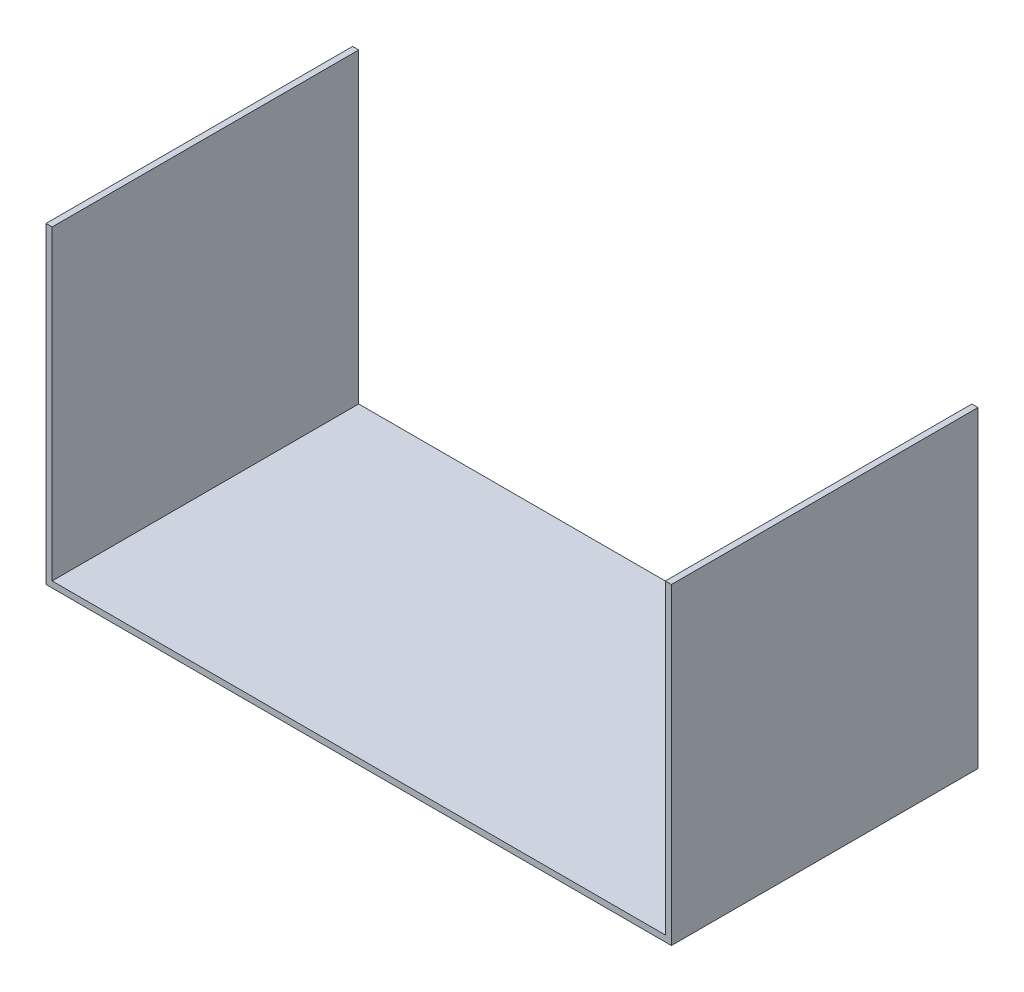
ISO-10303-21;
HEADER;
FILE_DESCRIPTION(('STEP AP214'),'2;1');
FILE_NAME('part.step','',(''),(''),'','','');
FILE_SCHEMA(('AUTOMOTIVE_DESIGN { 1 0 10303 214 1 1 1 1 }'));
ENDSEC;
DATA;
#1=APPLICATION_CONTEXT('core data for automotive mechanical design processes');
#2=APPLICATION_PROTOCOL_DEFINITION('international standard','automotive_design',2000,#1);
#3=PRODUCT_CONTEXT('',#1,'mechanical');
#4=PRODUCT('Part','Part','',(#3));
#5=PRODUCT_RELATED_PRODUCT_CATEGORY('part','',(#4));
#6=PRODUCT_DEFINITION_FORMATION('','',#4);
#7=PRODUCT_DEFINITION_CONTEXT('part definition',#1,'design');
#8=PRODUCT_DEFINITION('design','',#6,#7);
#9=PRODUCT_DEFINITION_SHAPE('','',#8);
#10=(LENGTH_UNIT() NAMED_UNIT(*) SI_UNIT(.MILLI.,.METRE.));
#11=(NAMED_UNIT(*) PLANE_ANGLE_UNIT() SI_UNIT($,.RADIAN.));
#12=(NAMED_UNIT(*) SI_UNIT($,.STERADIAN.) SOLID_ANGLE_UNIT());
#13=UNCERTAINTY_MEASURE_WITH_UNIT(LENGTH_MEASURE(1.E-05),#10,'distance_accuracy_value','');
#14=(GEOMETRIC_REPRESENTATION_CONTEXT(3) GLOBAL_UNCERTAINTY_ASSIGNED_CONTEXT((#13)) GLOBAL_UNIT_ASSIGNED_CONTEXT((#10,
#11,#12)) REPRESENTATION_CONTEXT('',''));
#15=CARTESIAN_POINT('',(0.,0.,0.));
#16=DIRECTION('',(0.,0.,1.));
#17=DIRECTION('',(1.,0.,0.));
#18=AXIS2_PLACEMENT_3D('',#15,#16,#17);
#19=CARTESIAN_POINT('',(-200.,0.,10000.));
#20=DIRECTION('',(0.,-1.,0.));
#21=DIRECTION('',(0.,0.,-1.));
#22=AXIS2_PLACEMENT_3D('',#19,#20,#21);
#23=PLANE('',#22);
#24=DIRECTION('',(-1.,0.,0.));
#25=VECTOR('',#24,1.);
#26=CARTESIAN_POINT('',(-200.,0.,0.));
#27=LINE('',#26,#25);
#28=CARTESIAN_POINT('',(0.,0.,0.));
#29=VERTEX_POINT('',#28);
#30=CARTESIAN_POINT('',(-200.,0.,0.));
#31=VERTEX_POINT('',#30);
#32=EDGE_CURVE('E137',#29,#31,#27,.T.);
#33=ORIENTED_EDGE('',*,*,#32,.T.);
#34=DIRECTION('',(0.,0.,-1.));
#35=VECTOR('',#34,1.);
#36=CARTESIAN_POINT('',(-200.,0.,10000.));
#37=LINE('',#36,#35);
#38=CARTESIAN_POINT('',(-200.,0.,10000.));
#39=VERTEX_POINT('',#38);
#40=EDGE_CURVE('E11',#39,#31,#37,.T.);
#41=ORIENTED_EDGE('',*,*,#40,.F.);
#42=DIRECTION('',(-1.,0.,0.));
#43=VECTOR('',#42,1.);
#44=CARTESIAN_POINT('',(-200.,0.,10000.));
#45=LINE('',#44,#43);
#46=CARTESIAN_POINT('',(0.,0.,10000.));
#47=VERTEX_POINT('',#46);
#48=EDGE_CURVE('E151',#47,#39,#45,.T.);
#49=ORIENTED_EDGE('',*,*,#48,.F.);
#50=DIRECTION('',(0.,0.,-1.));
#51=VECTOR('',#50,1.);
#52=CARTESIAN_POINT('',(0.,0.,10000.));
#53=LINE('',#52,#51);
#54=EDGE_CURVE('E133',#47,#29,#53,.T.);
#55=ORIENTED_EDGE('',*,*,#54,.T.);
#56=EDGE_LOOP('',(#33,#41,#49,#55));
#57=FACE_BOUND('',#56,.T.);
#58=ADVANCED_FACE('F41',(#57),#23,.F.);
#59=CARTESIAN_POINT('',(-200.,0.,10000.));
#60=DIRECTION('',(1.,0.,0.));
#61=DIRECTION('',(0.,0.,-1.));
#62=AXIS2_PLACEMENT_3D('',#59,#60,#61);
#63=PLANE('',#62);
#64=DIRECTION('',(0.,-1.,0.));
#65=VECTOR('',#64,1.);
#66=CARTESIAN_POINT('',(-200.,0.,0.));
#67=LINE('',#66,#65);
#68=CARTESIAN_POINT('',(-200.,-10200.,0.));
#69=VERTEX_POINT('',#68);
#70=EDGE_CURVE('E140',#31,#69,#67,.T.);
#71=ORIENTED_EDGE('',*,*,#70,.T.);
#72=DIRECTION('',(0.,0.,-1.));
#73=VECTOR('',#72,1.);
#74=CARTESIAN_POINT('',(-200.,-10200.,10000.));
#75=LINE('',#74,#73);
#76=CARTESIAN_POINT('',(-200.,-10200.,10000.));
#77=VERTEX_POINT('',#76);
#78=EDGE_CURVE('E49',#77,#69,#75,.T.);
#79=ORIENTED_EDGE('',*,*,#78,.F.);
#80=DIRECTION('',(0.,-1.,0.));
#81=VECTOR('',#80,1.);
#82=CARTESIAN_POINT('',(-200.,0.,10000.));
#83=LINE('',#82,#81);
#84=EDGE_CURVE('E100',#39,#77,#83,.T.);
#85=ORIENTED_EDGE('',*,*,#84,.F.);
#86=ORIENTED_EDGE('',*,*,#40,.T.);
#87=EDGE_LOOP('',(#71,#79,#85,#86));
#88=FACE_BOUND('',#87,.T.);
#89=ADVANCED_FACE('F186',(#88),#63,.F.);
#90=CARTESIAN_POINT('',(-200.,-10200.,10000.));
#91=DIRECTION('',(0.,1.,0.));
#92=DIRECTION('',(0.,0.,1.));
#93=AXIS2_PLACEMENT_3D('',#90,#91,#92);
#94=PLANE('',#93);
#95=DIRECTION('',(1.,0.,0.));
#96=VECTOR('',#95,1.);
#97=CARTESIAN_POINT('',(-200.,-10200.,0.));
#98=LINE('',#97,#96);
#99=CARTESIAN_POINT('',(20200.,-10200.,0.));
#100=VERTEX_POINT('',#99);
#101=EDGE_CURVE('E142',#69,#100,#98,.T.);
#102=ORIENTED_EDGE('',*,*,#101,.T.);
#103=DIRECTION('',(0.,0.,-1.));
#104=VECTOR('',#103,1.);
#105=CARTESIAN_POINT('',(20200.,-10200.,10000.));
#106=LINE('',#105,#104);
#107=CARTESIAN_POINT('',(20200.,-10200.,10000.));
#108=VERTEX_POINT('',#107);
#109=EDGE_CURVE('E158',#108,#100,#106,.T.);
#110=ORIENTED_EDGE('',*,*,#109,.F.);
#111=DIRECTION('',(1.,0.,0.));
#112=VECTOR('',#111,1.);
#113=CARTESIAN_POINT('',(-200.,-10200.,10000.));
#114=LINE('',#113,#112);
#115=EDGE_CURVE('E166',#77,#108,#114,.T.);
#116=ORIENTED_EDGE('',*,*,#115,.F.);
#117=ORIENTED_EDGE('',*,*,#78,.T.);
#118=EDGE_LOOP('',(#102,#110,#116,#117));
#119=FACE_BOUND('',#118,.T.);
#120=ADVANCED_FACE('F164',(#119),#94,.F.);
#121=CARTESIAN_POINT('',(20200.,-10200.,10000.));
#122=DIRECTION('',(-1.,0.,0.));
#123=DIRECTION('',(0.,0.,1.));
#124=AXIS2_PLACEMENT_3D('',#121,#122,#123);
#125=PLANE('',#124);
#126=DIRECTION('',(0.,1.,0.));
#127=VECTOR('',#126,1.);
#128=CARTESIAN_POINT('',(20200.,-10200.,0.));
#129=LINE('',#128,#127);
#130=CARTESIAN_POINT('',(20200.,0.,0.));
#131=VERTEX_POINT('',#130);
#132=EDGE_CURVE('E144',#100,#131,#129,.T.);
#133=ORIENTED_EDGE('',*,*,#132,.T.);
#134=DIRECTION('',(0.,0.,-1.));
#135=VECTOR('',#134,1.);
#136=CARTESIAN_POINT('',(20200.,0.,10000.));
#137=LINE('',#136,#135);
#138=CARTESIAN_POINT('',(20200.,0.,10000.));
#139=VERTEX_POINT('',#138);
#140=EDGE_CURVE('E155',#139,#131,#137,.T.);
#141=ORIENTED_EDGE('',*,*,#140,.F.);
#142=DIRECTION('',(0.,1.,0.));
#143=VECTOR('',#142,1.);
#144=CARTESIAN_POINT('',(20200.,-10200.,10000.));
#145=LINE('',#144,#143);
#146=EDGE_CURVE('E178',#108,#139,#145,.T.);
#147=ORIENTED_EDGE('',*,*,#146,.F.);
#148=ORIENTED_EDGE('',*,*,#109,.T.);
#149=EDGE_LOOP('',(#133,#141,#147,#148));
#150=FACE_BOUND('',#149,.T.);
#151=ADVANCED_FACE('F174',(#150),#125,.F.);
#152=CARTESIAN_POINT('',(20000.,0.,10000.));
#153=DIRECTION('',(0.,-1.,0.));
#154=DIRECTION('',(0.,0.,-1.));
#155=AXIS2_PLACEMENT_3D('',#152,#153,#154);
#156=PLANE('',#155);
#157=DIRECTION('',(-1.,0.,0.));
#158=VECTOR('',#157,1.);
#159=CARTESIAN_POINT('',(20000.,0.,0.));
#160=LINE('',#159,#158);
#161=CARTESIAN_POINT('',(20000.,0.,0.));
#162=VERTEX_POINT('',#161);
#163=EDGE_CURVE('E146',#131,#162,#160,.T.);
#164=ORIENTED_EDGE('',*,*,#163,.T.);
#165=DIRECTION('',(0.,0.,-1.));
#166=VECTOR('',#165,1.);
#167=CARTESIAN_POINT('',(20000.,0.,10000.));
#168=LINE('',#167,#166);
#169=CARTESIAN_POINT('',(20000.,0.,10000.));
#170=VERTEX_POINT('',#169);
#171=EDGE_CURVE('E128',#170,#162,#168,.T.);
#172=ORIENTED_EDGE('',*,*,#171,.F.);
#173=DIRECTION('',(-1.,0.,0.));
#174=VECTOR('',#173,1.);
#175=CARTESIAN_POINT('',(20000.,0.,10000.));
#176=LINE('',#175,#174);
#177=EDGE_CURVE('E119',#139,#170,#176,.T.);
#178=ORIENTED_EDGE('',*,*,#177,.F.);
#179=ORIENTED_EDGE('',*,*,#140,.T.);
#180=EDGE_LOOP('',(#164,#172,#178,#179));
#181=FACE_BOUND('',#180,.T.);
#182=ADVANCED_FACE('F177',(#181),#156,.F.);
#183=CARTESIAN_POINT('',(20000.,-10000.,10000.));
#184=DIRECTION('',(1.,0.,0.));
#185=DIRECTION('',(0.,0.,-1.));
#186=AXIS2_PLACEMENT_3D('',#183,#184,#185);
#187=PLANE('',#186);
#188=DIRECTION('',(0.,-1.,0.));
#189=VECTOR('',#188,1.);
#190=CARTESIAN_POINT('',(20000.,-10000.,0.));
#191=LINE('',#190,#189);
#192=CARTESIAN_POINT('',(20000.,-10000.,0.));
#193=VERTEX_POINT('',#192);
#194=EDGE_CURVE('E127',#162,#193,#191,.T.);
#195=ORIENTED_EDGE('',*,*,#194,.T.);
#196=DIRECTION('',(0.,0.,-1.));
#197=VECTOR('',#196,1.);
#198=CARTESIAN_POINT('',(20000.,-10000.,10000.));
#199=LINE('',#198,#197);
#200=CARTESIAN_POINT('',(20000.,-10000.,10000.));
#201=VERTEX_POINT('',#200);
#202=EDGE_CURVE('E124',#201,#193,#199,.T.);
#203=ORIENTED_EDGE('',*,*,#202,.F.);
#204=DIRECTION('',(0.,-1.,0.));
#205=VECTOR('',#204,1.);
#206=CARTESIAN_POINT('',(20000.,-10000.,10000.));
#207=LINE('',#206,#205);
#208=EDGE_CURVE('E113',#170,#201,#207,.T.);
#209=ORIENTED_EDGE('',*,*,#208,.F.);
#210=ORIENTED_EDGE('',*,*,#171,.T.);
#211=EDGE_LOOP('',(#195,#203,#209,#210));
#212=FACE_BOUND('',#211,.T.);
#213=ADVANCED_FACE('F125',(#212),#187,.F.);
#214=CARTESIAN_POINT('',(0.,-10000.,10000.));
#215=DIRECTION('',(0.,-1.,0.));
#216=DIRECTION('',(0.,0.,-1.));
#217=AXIS2_PLACEMENT_3D('',#214,#215,#216);
#218=PLANE('',#217);
#219=DIRECTION('',(-1.,0.,0.));
#220=VECTOR('',#219,1.);
#221=CARTESIAN_POINT('',(0.,-10000.,0.));
#222=LINE('',#221,#220);
#223=CARTESIAN_POINT('',(0.,-10000.,0.));
#224=VERTEX_POINT('',#223);
#225=EDGE_CURVE('E86',#193,#224,#222,.T.);
#226=ORIENTED_EDGE('',*,*,#225,.T.);
#227=DIRECTION('',(0.,0.,-1.));
#228=VECTOR('',#227,1.);
#229=CARTESIAN_POINT('',(0.,-10000.,10000.));
#230=LINE('',#229,#228);
#231=CARTESIAN_POINT('',(0.,-10000.,10000.));
#232=VERTEX_POINT('',#231);
#233=EDGE_CURVE('E129',#232,#224,#230,.T.);
#234=ORIENTED_EDGE('',*,*,#233,.F.);
#235=DIRECTION('',(-1.,0.,0.));
#236=VECTOR('',#235,1.);
#237=CARTESIAN_POINT('',(0.,-10000.,10000.));
#238=LINE('',#237,#236);
#239=EDGE_CURVE('E117',#201,#232,#238,.T.);
#240=ORIENTED_EDGE('',*,*,#239,.F.);
#241=ORIENTED_EDGE('',*,*,#202,.T.);
#242=EDGE_LOOP('',(#226,#234,#240,#241));
#243=FACE_BOUND('',#242,.T.);
#244=ADVANCED_FACE('F131',(#243),#218,.F.);
#245=CARTESIAN_POINT('',(0.,0.,10000.));
#246=DIRECTION('',(-1.,0.,0.));
#247=DIRECTION('',(0.,0.,1.));
#248=AXIS2_PLACEMENT_3D('',#245,#246,#247);
#249=PLANE('',#248);
#250=DIRECTION('',(0.,1.,0.));
#251=VECTOR('',#250,1.);
#252=CARTESIAN_POINT('',(0.,0.,0.));
#253=LINE('',#252,#251);
#254=EDGE_CURVE('E92',#224,#29,#253,.T.);
#255=ORIENTED_EDGE('',*,*,#254,.T.);
#256=ORIENTED_EDGE('',*,*,#54,.F.);
#257=DIRECTION('',(0.,1.,0.));
#258=VECTOR('',#257,1.);
#259=CARTESIAN_POINT('',(0.,0.,10000.));
#260=LINE('',#259,#258);
#261=EDGE_CURVE('E57',#232,#47,#260,.T.);
#262=ORIENTED_EDGE('',*,*,#261,.F.);
#263=ORIENTED_EDGE('',*,*,#233,.T.);
#264=EDGE_LOOP('',(#255,#256,#262,#263));
#265=FACE_BOUND('',#264,.T.);
#266=ADVANCED_FACE('F202',(#265),#249,.F.);
#267=CARTESIAN_POINT('',(0.,0.,10000.));
#268=DIRECTION('',(0.,0.,-1.));
#269=DIRECTION('',(-1.,0.,0.));
#270=AXIS2_PLACEMENT_3D('',#267,#268,#269);
#271=PLANE('',#270);
#272=ORIENTED_EDGE('',*,*,#48,.T.);
#273=ORIENTED_EDGE('',*,*,#84,.T.);
#274=ORIENTED_EDGE('',*,*,#115,.T.);
#275=ORIENTED_EDGE('',*,*,#146,.T.);
#276=ORIENTED_EDGE('',*,*,#177,.T.);
#277=ORIENTED_EDGE('',*,*,#208,.T.);
#278=ORIENTED_EDGE('',*,*,#239,.T.);
#279=ORIENTED_EDGE('',*,*,#261,.T.);
#280=EDGE_LOOP('',(#272,#273,#274,#275,#276,#277,#278,#279));
#281=FACE_BOUND('',#280,.T.);
#282=ADVANCED_FACE('F115',(#281),#271,.F.);
#283=CARTESIAN_POINT('',(0.,0.,0.));
#284=DIRECTION('',(0.,0.,-1.));
#285=DIRECTION('',(-1.,0.,0.));
#286=AXIS2_PLACEMENT_3D('',#283,#284,#285);
#287=PLANE('',#286);
#288=ORIENTED_EDGE('',*,*,#32,.F.);
#289=ORIENTED_EDGE('',*,*,#254,.F.);
#290=ORIENTED_EDGE('',*,*,#225,.F.);
#291=ORIENTED_EDGE('',*,*,#194,.F.);
#292=ORIENTED_EDGE('',*,*,#163,.F.);
#293=ORIENTED_EDGE('',*,*,#132,.F.);
#294=ORIENTED_EDGE('',*,*,#101,.F.);
#295=ORIENTED_EDGE('',*,*,#70,.F.);
#296=EDGE_LOOP('',(#288,#289,#290,#291,#292,#293,#294,#295));
#297=FACE_BOUND('',#296,.T.);
#298=ADVANCED_FACE('F170',(#297),#287,.T.);
#299=CLOSED_SHELL('',(#58,#89,#120,#151,#182,#213,#244,#266,#282,#298));
#300=MANIFOLD_SOLID_BREP('B2',#299);
#301=ADVANCED_BREP_SHAPE_REPRESENTATION('',(#18,#300),#14);
#302=SHAPE_DEFINITION_REPRESENTATION(#9,#301);
ENDSEC;
END-ISO-10303-21;
